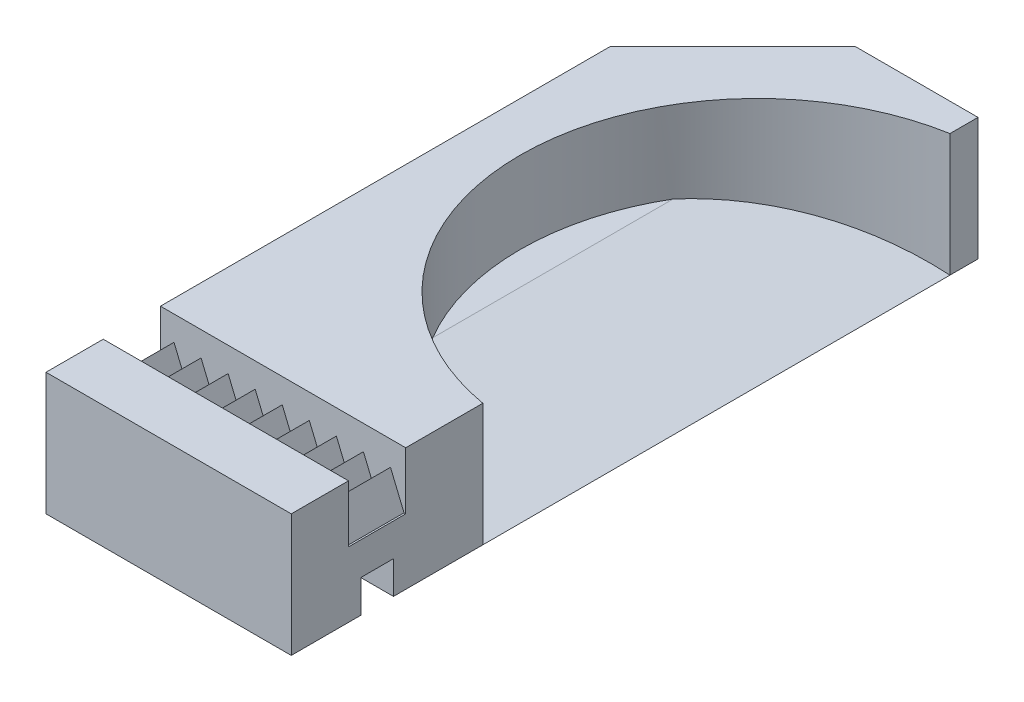
ISO-10303-21;
HEADER;
FILE_DESCRIPTION(('STEP AP214'),'2;1');
FILE_NAME('part.step','',(''),(''),'','','');
FILE_SCHEMA(('AUTOMOTIVE_DESIGN { 1 0 10303 214 1 1 1 1 }'));
ENDSEC;
DATA;
#1=APPLICATION_CONTEXT('core data for automotive mechanical design processes');
#2=APPLICATION_PROTOCOL_DEFINITION('international standard','automotive_design',2000,#1);
#3=PRODUCT_CONTEXT('',#1,'mechanical');
#4=PRODUCT('Part','Part','',(#3));
#5=PRODUCT_RELATED_PRODUCT_CATEGORY('part','',(#4));
#6=PRODUCT_DEFINITION_FORMATION('','',#4);
#7=PRODUCT_DEFINITION_CONTEXT('part definition',#1,'design');
#8=PRODUCT_DEFINITION('design','',#6,#7);
#9=PRODUCT_DEFINITION_SHAPE('','',#8);
#10=(LENGTH_UNIT() NAMED_UNIT(*) SI_UNIT(.MILLI.,.METRE.));
#11=(NAMED_UNIT(*) PLANE_ANGLE_UNIT() SI_UNIT($,.RADIAN.));
#12=(NAMED_UNIT(*) SI_UNIT($,.STERADIAN.) SOLID_ANGLE_UNIT());
#13=UNCERTAINTY_MEASURE_WITH_UNIT(LENGTH_MEASURE(1.E-05),#10,'distance_accuracy_value','');
#14=(GEOMETRIC_REPRESENTATION_CONTEXT(3) GLOBAL_UNCERTAINTY_ASSIGNED_CONTEXT((#13)) GLOBAL_UNIT_ASSIGNED_CONTEXT((#10,
#11,#12)) REPRESENTATION_CONTEXT('',''));
#15=CARTESIAN_POINT('',(0.,0.,0.));
#16=DIRECTION('',(0.,0.,1.));
#17=DIRECTION('',(1.,0.,0.));
#18=AXIS2_PLACEMENT_3D('',#15,#16,#17);
#19=CARTESIAN_POINT('',(-32.4128547970913,15.,-40.7804396814199));
#20=DIRECTION('',(1.,0.,0.));
#21=DIRECTION('',(0.,0.,-1.));
#22=AXIS2_PLACEMENT_3D('',#19,#20,#21);
#23=PLANE('',#22);
#24=DIRECTION('',(0.,-1.,0.));
#25=VECTOR('',#24,1.);
#26=CARTESIAN_POINT('',(-32.4128547970913,0.,34.7195603185801));
#27=LINE('',#26,#25);
#28=CARTESIAN_POINT('',(-32.4128547970913,4.,34.7195603185801));
#29=VERTEX_POINT('',#28);
#30=CARTESIAN_POINT('',(-32.4128547970913,0.,34.7195603185801));
#31=VERTEX_POINT('',#30);
#32=EDGE_CURVE('E262',#29,#31,#27,.T.);
#33=ORIENTED_EDGE('',*,*,#32,.T.);
#34=DIRECTION('',(0.,0.,1.));
#35=VECTOR('',#34,1.);
#36=CARTESIAN_POINT('',(-32.4128547970913,0.,-40.7804396814199));
#37=LINE('',#36,#35);
#38=CARTESIAN_POINT('',(-32.4128547970913,0.,43.2195603185801));
#39=VERTEX_POINT('',#38);
#40=EDGE_CURVE('E275',#31,#39,#37,.T.);
#41=ORIENTED_EDGE('',*,*,#40,.T.);
#42=DIRECTION('',(0.,-1.,0.));
#43=VECTOR('',#42,1.);
#44=CARTESIAN_POINT('',(-32.4128547970913,15.,43.2195603185801));
#45=LINE('',#44,#43);
#46=CARTESIAN_POINT('',(-32.4128547970913,15.,43.2195603185801));
#47=VERTEX_POINT('',#46);
#48=EDGE_CURVE('E310',#47,#39,#45,.T.);
#49=ORIENTED_EDGE('',*,*,#48,.F.);
#50=DIRECTION('',(0.,0.,1.));
#51=VECTOR('',#50,1.);
#52=CARTESIAN_POINT('',(-32.4128547970913,15.,-40.7804396814199));
#53=LINE('',#52,#51);
#54=CARTESIAN_POINT('',(-32.4128547970913,15.,36.2195603185801));
#55=VERTEX_POINT('',#54);
#56=EDGE_CURVE('E303',#55,#47,#53,.T.);
#57=ORIENTED_EDGE('',*,*,#56,.F.);
#58=DIRECTION('',(0.,1.,0.));
#59=VECTOR('',#58,1.);
#60=CARTESIAN_POINT('',(-32.4128547970913,8.,36.2195603185801));
#61=LINE('',#60,#59);
#62=CARTESIAN_POINT('',(-32.4128547970913,8.,36.2195603185801));
#63=VERTEX_POINT('',#62);
#64=EDGE_CURVE('E402',#63,#55,#61,.T.);
#65=ORIENTED_EDGE('',*,*,#64,.F.);
#66=DIRECTION('',(0.,0.,-1.));
#67=VECTOR('',#66,1.);
#68=CARTESIAN_POINT('',(-32.4128547970913,8.,36.2195603185801));
#69=LINE('',#68,#67);
#70=CARTESIAN_POINT('',(-32.4128547970913,8.,29.2195603185801));
#71=VERTEX_POINT('',#70);
#72=EDGE_CURVE('E404',#63,#71,#69,.T.);
#73=ORIENTED_EDGE('',*,*,#72,.T.);
#74=DIRECTION('',(0.,1.,0.));
#75=VECTOR('',#74,1.);
#76=CARTESIAN_POINT('',(-32.4128547970913,8.,29.2195603185801));
#77=LINE('',#76,#75);
#78=CARTESIAN_POINT('',(-32.4128547970913,15.,29.2195603185801));
#79=VERTEX_POINT('',#78);
#80=EDGE_CURVE('E342',#71,#79,#77,.T.);
#81=ORIENTED_EDGE('',*,*,#80,.T.);
#82=CARTESIAN_POINT('',(-32.4128547970913,15.,-25.7804396814199));
#83=VERTEX_POINT('',#82);
#84=EDGE_CURVE('E333',#83,#79,#53,.T.);
#85=ORIENTED_EDGE('',*,*,#84,.F.);
#86=DIRECTION('',(0.,-1.,0.));
#87=VECTOR('',#86,1.);
#88=CARTESIAN_POINT('',(-32.4128547970913,15.,-25.7804396814199));
#89=LINE('',#88,#87);
#90=CARTESIAN_POINT('',(-32.4128547970913,0.,-25.7804396814199));
#91=VERTEX_POINT('',#90);
#92=EDGE_CURVE('E320',#83,#91,#89,.T.);
#93=ORIENTED_EDGE('',*,*,#92,.T.);
#94=CARTESIAN_POINT('',(-32.4128547970913,0.,30.71956031858));
#95=VERTEX_POINT('',#94);
#96=EDGE_CURVE('E283',#91,#95,#37,.T.);
#97=ORIENTED_EDGE('',*,*,#96,.T.);
#98=DIRECTION('',(0.,-1.,0.));
#99=VECTOR('',#98,1.);
#100=CARTESIAN_POINT('',(-32.4128547970913,0.,30.7195603185801));
#101=LINE('',#100,#99);
#102=CARTESIAN_POINT('',(-32.4128547970913,4.,30.7195603185801));
#103=VERTEX_POINT('',#102);
#104=EDGE_CURVE('E52',#103,#95,#101,.T.);
#105=ORIENTED_EDGE('',*,*,#104,.F.);
#106=DIRECTION('',(0.,0.,1.));
#107=VECTOR('',#106,1.);
#108=CARTESIAN_POINT('',(-32.4128547970913,4.,34.7195603185801));
#109=LINE('',#108,#107);
#110=EDGE_CURVE('E278',#103,#29,#109,.T.);
#111=ORIENTED_EDGE('',*,*,#110,.T.);
#112=EDGE_LOOP('',(#33,#41,#49,#57,#65,#73,#81,#85,#93,#97,#105,#111));
#113=FACE_BOUND('',#112,.T.);
#114=ADVANCED_FACE('F37',(#113),#23,.F.);
#115=CARTESIAN_POINT('',(-2.41285479709127,15.,-40.7804396814199));
#116=DIRECTION('',(-1.,0.,0.));
#117=DIRECTION('',(0.,0.,1.));
#118=AXIS2_PLACEMENT_3D('',#115,#116,#117);
#119=PLANE('',#118);
#120=DIRECTION('',(0.,1.,0.));
#121=VECTOR('',#120,1.);
#122=CARTESIAN_POINT('',(-2.41285479709126,0.,34.7195603185801));
#123=LINE('',#122,#121);
#124=CARTESIAN_POINT('',(-2.41285479709126,0.,34.7195603185801));
#125=VERTEX_POINT('',#124);
#126=CARTESIAN_POINT('',(-2.41285479709126,4.,34.7195603185801));
#127=VERTEX_POINT('',#126);
#128=EDGE_CURVE('E265',#125,#127,#123,.T.);
#129=ORIENTED_EDGE('',*,*,#128,.T.);
#130=DIRECTION('',(0.,0.,-1.));
#131=VECTOR('',#130,1.);
#132=CARTESIAN_POINT('',(-2.41285479709126,4.,34.7195603185801));
#133=LINE('',#132,#131);
#134=CARTESIAN_POINT('',(-2.41285479709126,4.,30.7195603185801));
#135=VERTEX_POINT('',#134);
#136=EDGE_CURVE('E641',#127,#135,#133,.T.);
#137=ORIENTED_EDGE('',*,*,#136,.T.);
#138=DIRECTION('',(0.,1.,0.));
#139=VECTOR('',#138,1.);
#140=CARTESIAN_POINT('',(-2.41285479709126,0.,30.7195603185801));
#141=LINE('',#140,#139);
#142=CARTESIAN_POINT('',(-2.41285479709126,0.,30.7195603185801));
#143=VERTEX_POINT('',#142);
#144=EDGE_CURVE('E271',#143,#135,#141,.T.);
#145=ORIENTED_EDGE('',*,*,#144,.F.);
#146=DIRECTION('',(0.,0.,-1.));
#147=VECTOR('',#146,1.);
#148=CARTESIAN_POINT('',(-2.41285479709127,0.,-40.7804396814199));
#149=LINE('',#148,#147);
#150=CARTESIAN_POINT('',(-2.41285479709127,0.,19.7852740327515));
#151=VERTEX_POINT('',#150);
#152=EDGE_CURVE('E299',#143,#151,#149,.T.);
#153=ORIENTED_EDGE('',*,*,#152,.T.);
#154=DIRECTION('',(0.,1.,0.));
#155=VECTOR('',#154,1.);
#156=CARTESIAN_POINT('',(-2.41285479709126,5.,19.7852740327515));
#157=LINE('',#156,#155);
#158=CARTESIAN_POINT('',(-2.41285479709126,15.,19.7852740327515));
#159=VERTEX_POINT('',#158);
#160=EDGE_CURVE('E284',#151,#159,#157,.T.);
#161=ORIENTED_EDGE('',*,*,#160,.T.);
#162=DIRECTION('',(0.,0.,-1.));
#163=VECTOR('',#162,1.);
#164=CARTESIAN_POINT('',(-2.41285479709127,15.,-40.7804396814199));
#165=LINE('',#164,#163);
#166=CARTESIAN_POINT('',(-2.41285479709127,15.,29.2195603185801));
#167=VERTEX_POINT('',#166);
#168=EDGE_CURVE('E390',#167,#159,#165,.T.);
#169=ORIENTED_EDGE('',*,*,#168,.F.);
#170=DIRECTION('',(0.,1.,0.));
#171=VECTOR('',#170,1.);
#172=CARTESIAN_POINT('',(-2.41285479709126,8.,29.2195603185801));
#173=LINE('',#172,#171);
#174=CARTESIAN_POINT('',(-2.41285479709126,8.,29.2195603185801));
#175=VERTEX_POINT('',#174);
#176=EDGE_CURVE('E385',#175,#167,#173,.T.);
#177=ORIENTED_EDGE('',*,*,#176,.F.);
#178=DIRECTION('',(0.,0.,-1.));
#179=VECTOR('',#178,1.);
#180=CARTESIAN_POINT('',(-2.41285479709126,8.,36.2195603185801));
#181=LINE('',#180,#179);
#182=CARTESIAN_POINT('',(-2.41285479709126,8.,36.2195603185801));
#183=VERTEX_POINT('',#182);
#184=EDGE_CURVE('E399',#183,#175,#181,.T.);
#185=ORIENTED_EDGE('',*,*,#184,.F.);
#186=DIRECTION('',(0.,1.,0.));
#187=VECTOR('',#186,1.);
#188=CARTESIAN_POINT('',(-2.41285479709126,8.,36.2195603185801));
#189=LINE('',#188,#187);
#190=CARTESIAN_POINT('',(-2.41285479709126,15.,36.2195603185801));
#191=VERTEX_POINT('',#190);
#192=EDGE_CURVE('E382',#183,#191,#189,.T.);
#193=ORIENTED_EDGE('',*,*,#192,.T.);
#194=CARTESIAN_POINT('',(-2.41285479709126,15.,43.2195603185801));
#195=VERTEX_POINT('',#194);
#196=EDGE_CURVE('E388',#195,#191,#165,.T.);
#197=ORIENTED_EDGE('',*,*,#196,.F.);
#198=DIRECTION('',(0.,-1.,0.));
#199=VECTOR('',#198,1.);
#200=CARTESIAN_POINT('',(-2.41285479709126,15.,43.2195603185801));
#201=LINE('',#200,#199);
#202=CARTESIAN_POINT('',(-2.41285479709126,0.,43.2195603185801));
#203=VERTEX_POINT('',#202);
#204=EDGE_CURVE('E307',#195,#203,#201,.T.);
#205=ORIENTED_EDGE('',*,*,#204,.T.);
#206=EDGE_CURVE('E296',#203,#125,#149,.T.);
#207=ORIENTED_EDGE('',*,*,#206,.T.);
#208=EDGE_LOOP('',(#129,#137,#145,#153,#161,#169,#177,#185,#193,#197,#205,#207));
#209=FACE_BOUND('',#208,.T.);
#210=ADVANCED_FACE('F362',(#209),#119,.F.);
#211=CARTESIAN_POINT('',(0.,0.,0.));
#212=DIRECTION('',(0.,1.,0.));
#213=DIRECTION('',(0.,0.,1.));
#214=AXIS2_PLACEMENT_3D('',#211,#212,#213);
#215=PLANE('',#214);
#216=DIRECTION('',(1.,0.,0.));
#217=VECTOR('',#216,1.);
#218=CARTESIAN_POINT('',(-32.4138547970913,0.,34.7195603185801));
#219=LINE('',#218,#217);
#220=EDGE_CURVE('E259',#31,#125,#219,.T.);
#221=ORIENTED_EDGE('',*,*,#220,.T.);
#222=ORIENTED_EDGE('',*,*,#206,.F.);
#223=DIRECTION('',(1.,0.,0.));
#224=VECTOR('',#223,1.);
#225=CARTESIAN_POINT('',(-32.4128547970913,0.,43.2195603185801));
#226=LINE('',#225,#224);
#227=EDGE_CURVE('E281',#39,#203,#226,.T.);
#228=ORIENTED_EDGE('',*,*,#227,.F.);
#229=ORIENTED_EDGE('',*,*,#40,.F.);
#230=EDGE_LOOP('',(#221,#222,#228,#229));
#231=FACE_BOUND('',#230,.T.);
#232=ADVANCED_FACE('F280',(#231),#215,.F.);
#233=CARTESIAN_POINT('',(-2.41285479709126,8.,36.2195603185801));
#234=DIRECTION('',(0.,0.,-1.));
#235=DIRECTION('',(-1.,0.,0.));
#236=AXIS2_PLACEMENT_3D('',#233,#234,#235);
#237=PLANE('',#236);
#238=DIRECTION('',(-0.382683432365093,0.923879532511285,0.));
#239=VECTOR('',#238,1.);
#240=CARTESIAN_POINT('',(-25.7891462981065,8.,36.2195603185801));
#241=LINE('',#240,#239);
#242=CARTESIAN_POINT('',(-25.7910005475989,8.00447655427257,36.2195603185801));
#243=VERTEX_POINT('',#242);
#244=CARTESIAN_POINT('',(-27.4460005475989,12.,36.2195603185801));
#245=VERTEX_POINT('',#244);
#246=EDGE_CURVE('E60',#243,#245,#241,.T.);
#247=ORIENTED_EDGE('',*,*,#246,.T.);
#248=DIRECTION('',(-0.382683432365093,-0.923879532511285,0.));
#249=VECTOR('',#248,1.);
#250=CARTESIAN_POINT('',(-27.4460005475989,12.,36.2195603185801));
#251=LINE('',#250,#249);
#252=CARTESIAN_POINT('',(-29.1010005475989,8.00447655427257,36.2195603185801));
#253=VERTEX_POINT('',#252);
#254=EDGE_CURVE('E542',#245,#253,#251,.T.);
#255=ORIENTED_EDGE('',*,*,#254,.T.);
#256=DIRECTION('',(-0.382683432365093,0.923879532511285,0.));
#257=VECTOR('',#256,1.);
#258=CARTESIAN_POINT('',(-29.0991462981065,8.,36.2195603185801));
#259=LINE('',#258,#257);
#260=CARTESIAN_POINT('',(-30.7560005475989,12.,36.2195603185801));
#261=VERTEX_POINT('',#260);
#262=EDGE_CURVE('E555',#253,#261,#259,.T.);
#263=ORIENTED_EDGE('',*,*,#262,.T.);
#264=DIRECTION('',(-0.382683432365093,-0.923879532511285,0.));
#265=VECTOR('',#264,1.);
#266=CARTESIAN_POINT('',(-30.7560005475989,12.,36.2195603185801));
#267=LINE('',#266,#265);
#268=EDGE_CURVE('E421',#261,#63,#267,.T.);
#269=ORIENTED_EDGE('',*,*,#268,.T.);
#270=ORIENTED_EDGE('',*,*,#64,.T.);
#271=DIRECTION('',(-1.,0.,0.));
#272=VECTOR('',#271,1.);
#273=CARTESIAN_POINT('',(-2.41285479709126,15.,36.2195603185801));
#274=LINE('',#273,#272);
#275=EDGE_CURVE('E413',#191,#55,#274,.T.);
#276=ORIENTED_EDGE('',*,*,#275,.F.);
#277=ORIENTED_EDGE('',*,*,#192,.F.);
#278=DIRECTION('',(-1.,0.,0.));
#279=VECTOR('',#278,1.);
#280=CARTESIAN_POINT('',(-2.41285479709126,8.,36.2195603185801));
#281=LINE('',#280,#279);
#282=CARTESIAN_POINT('',(-2.61914629810648,8.,36.2195603185801));
#283=VERTEX_POINT('',#282);
#284=EDGE_CURVE('E401',#183,#283,#281,.T.);
#285=ORIENTED_EDGE('',*,*,#284,.T.);
#286=DIRECTION('',(-0.382683432365093,0.923879532511285,0.));
#287=VECTOR('',#286,1.);
#288=CARTESIAN_POINT('',(-2.61914629810648,8.,36.2195603185801));
#289=LINE('',#288,#287);
#290=CARTESIAN_POINT('',(-4.27600054759887,12.,36.2195603185801));
#291=VERTEX_POINT('',#290);
#292=EDGE_CURVE('E442',#283,#291,#289,.T.);
#293=ORIENTED_EDGE('',*,*,#292,.T.);
#294=DIRECTION('',(-0.382683432365093,-0.923879532511285,0.));
#295=VECTOR('',#294,1.);
#296=CARTESIAN_POINT('',(-4.27600054759887,12.,36.2195603185801));
#297=LINE('',#296,#295);
#298=CARTESIAN_POINT('',(-5.93100054759887,8.00447655427257,36.2195603185801));
#299=VERTEX_POINT('',#298);
#300=EDGE_CURVE('E632',#291,#299,#297,.T.);
#301=ORIENTED_EDGE('',*,*,#300,.T.);
#302=DIRECTION('',(-0.382683432365093,0.923879532511285,0.));
#303=VECTOR('',#302,1.);
#304=CARTESIAN_POINT('',(-5.92914629810648,8.,36.2195603185801));
#305=LINE('',#304,#303);
#306=CARTESIAN_POINT('',(-7.58600054759887,12.,36.2195603185801));
#307=VERTEX_POINT('',#306);
#308=EDGE_CURVE('E448',#299,#307,#305,.T.);
#309=ORIENTED_EDGE('',*,*,#308,.T.);
#310=DIRECTION('',(-0.382683432365093,-0.923879532511285,0.));
#311=VECTOR('',#310,1.);
#312=CARTESIAN_POINT('',(-7.58600054759887,12.,36.2195603185801));
#313=LINE('',#312,#311);
#314=CARTESIAN_POINT('',(-9.24100054759888,8.00447655427257,36.2195603185801));
#315=VERTEX_POINT('',#314);
#316=EDGE_CURVE('E446',#307,#315,#313,.T.);
#317=ORIENTED_EDGE('',*,*,#316,.T.);
#318=DIRECTION('',(-0.382683432365093,0.923879532511285,0.));
#319=VECTOR('',#318,1.);
#320=CARTESIAN_POINT('',(-9.23914629810648,8.,36.2195603185801));
#321=LINE('',#320,#319);
#322=CARTESIAN_POINT('',(-10.8960005475989,12.,36.2195603185801));
#323=VERTEX_POINT('',#322);
#324=EDGE_CURVE('E464',#315,#323,#321,.T.);
#325=ORIENTED_EDGE('',*,*,#324,.T.);
#326=DIRECTION('',(-0.382683432365093,-0.923879532511285,0.));
#327=VECTOR('',#326,1.);
#328=CARTESIAN_POINT('',(-10.8960005475989,12.,36.2195603185801));
#329=LINE('',#328,#327);
#330=CARTESIAN_POINT('',(-12.5510005475989,8.00447655427257,36.2195603185801));
#331=VERTEX_POINT('',#330);
#332=EDGE_CURVE('E462',#323,#331,#329,.T.);
#333=ORIENTED_EDGE('',*,*,#332,.T.);
#334=DIRECTION('',(-0.382683432365093,0.923879532511285,0.));
#335=VECTOR('',#334,1.);
#336=CARTESIAN_POINT('',(-12.5491462981065,8.,36.2195603185801));
#337=LINE('',#336,#335);
#338=CARTESIAN_POINT('',(-14.2060005475989,12.,36.2195603185801));
#339=VERTEX_POINT('',#338);
#340=EDGE_CURVE('E480',#331,#339,#337,.T.);
#341=ORIENTED_EDGE('',*,*,#340,.T.);
#342=DIRECTION('',(-0.382683432365093,-0.923879532511285,0.));
#343=VECTOR('',#342,1.);
#344=CARTESIAN_POINT('',(-14.2060005475989,12.,36.2195603185801));
#345=LINE('',#344,#343);
#346=CARTESIAN_POINT('',(-15.8610005475989,8.00447655427257,36.2195603185801));
#347=VERTEX_POINT('',#346);
#348=EDGE_CURVE('E478',#339,#347,#345,.T.);
#349=ORIENTED_EDGE('',*,*,#348,.T.);
#350=DIRECTION('',(-0.382683432365093,0.923879532511285,0.));
#351=VECTOR('',#350,1.);
#352=CARTESIAN_POINT('',(-15.8591462981065,8.,36.2195603185801));
#353=LINE('',#352,#351);
#354=CARTESIAN_POINT('',(-17.5160005475989,12.,36.2195603185801));
#355=VERTEX_POINT('',#354);
#356=EDGE_CURVE('E496',#347,#355,#353,.T.);
#357=ORIENTED_EDGE('',*,*,#356,.T.);
#358=DIRECTION('',(-0.382683432365093,-0.923879532511285,0.));
#359=VECTOR('',#358,1.);
#360=CARTESIAN_POINT('',(-17.5160005475989,12.,36.2195603185801));
#361=LINE('',#360,#359);
#362=CARTESIAN_POINT('',(-19.1710005475989,8.00447655427257,36.2195603185801));
#363=VERTEX_POINT('',#362);
#364=EDGE_CURVE('E494',#355,#363,#361,.T.);
#365=ORIENTED_EDGE('',*,*,#364,.T.);
#366=DIRECTION('',(-0.382683432365093,0.923879532511285,0.));
#367=VECTOR('',#366,1.);
#368=CARTESIAN_POINT('',(-19.1691462981065,8.,36.2195603185801));
#369=LINE('',#368,#367);
#370=CARTESIAN_POINT('',(-20.8260005475989,12.,36.2195603185801));
#371=VERTEX_POINT('',#370);
#372=EDGE_CURVE('E512',#363,#371,#369,.T.);
#373=ORIENTED_EDGE('',*,*,#372,.T.);
#374=DIRECTION('',(-0.382683432365093,-0.923879532511285,0.));
#375=VECTOR('',#374,1.);
#376=CARTESIAN_POINT('',(-20.8260005475989,12.,36.2195603185801));
#377=LINE('',#376,#375);
#378=CARTESIAN_POINT('',(-22.4810005475989,8.00447655427257,36.2195603185801));
#379=VERTEX_POINT('',#378);
#380=EDGE_CURVE('E510',#371,#379,#377,.T.);
#381=ORIENTED_EDGE('',*,*,#380,.T.);
#382=DIRECTION('',(-0.382683432365093,0.923879532511285,0.));
#383=VECTOR('',#382,1.);
#384=CARTESIAN_POINT('',(-22.4791462981065,8.,36.2195603185801));
#385=LINE('',#384,#383);
#386=CARTESIAN_POINT('',(-24.1360005475989,12.,36.2195603185801));
#387=VERTEX_POINT('',#386);
#388=EDGE_CURVE('E528',#379,#387,#385,.T.);
#389=ORIENTED_EDGE('',*,*,#388,.T.);
#390=DIRECTION('',(-0.382683432365093,-0.923879532511285,0.));
#391=VECTOR('',#390,1.);
#392=CARTESIAN_POINT('',(-24.1360005475989,12.,36.2195603185801));
#393=LINE('',#392,#391);
#394=EDGE_CURVE('E526',#387,#243,#393,.T.);
#395=ORIENTED_EDGE('',*,*,#394,.T.);
#396=EDGE_LOOP('',(#247,#255,#263,#269,#270,#276,#277,#285,#293,#301,#309,#317,#325,#333,#341,
#349,#357,#365,#373,#381,#389,#395));
#397=FACE_BOUND('',#396,.T.);
#398=ADVANCED_FACE('F419',(#397),#237,.T.);
#399=CARTESIAN_POINT('',(-2.41285479709126,8.,29.2195603185801));
#400=DIRECTION('',(0.,0.,-1.));
#401=DIRECTION('',(-1.,0.,0.));
#402=AXIS2_PLACEMENT_3D('',#399,#400,#401);
#403=PLANE('',#402);
#404=DIRECTION('',(-0.382683432365093,-0.923879532511285,0.));
#405=VECTOR('',#404,1.);
#406=CARTESIAN_POINT('',(-27.4460005475989,12.,29.2195603185801));
#407=LINE('',#406,#405);
#408=CARTESIAN_POINT('',(-27.4460005475989,12.,29.2195603185801));
#409=VERTEX_POINT('',#408);
#410=CARTESIAN_POINT('',(-29.1010005475989,8.00447655427257,29.2195603185801));
#411=VERTEX_POINT('',#410);
#412=EDGE_CURVE('E541',#409,#411,#407,.T.);
#413=ORIENTED_EDGE('',*,*,#412,.F.);
#414=DIRECTION('',(-0.382683432365093,0.923879532511285,0.));
#415=VECTOR('',#414,1.);
#416=CARTESIAN_POINT('',(-25.7891462981065,8.,29.2195603185801));
#417=LINE('',#416,#415);
#418=CARTESIAN_POINT('',(-25.7910005475989,8.00447655427257,29.2195603185801));
#419=VERTEX_POINT('',#418);
#420=EDGE_CURVE('E544',#419,#409,#417,.T.);
#421=ORIENTED_EDGE('',*,*,#420,.F.);
#422=DIRECTION('',(-0.382683432365093,-0.923879532511285,0.));
#423=VECTOR('',#422,1.);
#424=CARTESIAN_POINT('',(-24.1360005475989,12.,29.2195603185801));
#425=LINE('',#424,#423);
#426=CARTESIAN_POINT('',(-24.1360005475989,12.,29.2195603185801));
#427=VERTEX_POINT('',#426);
#428=EDGE_CURVE('E525',#427,#419,#425,.T.);
#429=ORIENTED_EDGE('',*,*,#428,.F.);
#430=DIRECTION('',(-0.382683432365093,0.923879532511285,0.));
#431=VECTOR('',#430,1.);
#432=CARTESIAN_POINT('',(-22.4791462981065,8.,29.2195603185801));
#433=LINE('',#432,#431);
#434=CARTESIAN_POINT('',(-22.4810005475989,8.00447655427257,29.2195603185801));
#435=VERTEX_POINT('',#434);
#436=EDGE_CURVE('E529',#435,#427,#433,.T.);
#437=ORIENTED_EDGE('',*,*,#436,.F.);
#438=DIRECTION('',(-0.382683432365093,-0.923879532511285,0.));
#439=VECTOR('',#438,1.);
#440=CARTESIAN_POINT('',(-20.8260005475989,12.,29.2195603185801));
#441=LINE('',#440,#439);
#442=CARTESIAN_POINT('',(-20.8260005475989,12.,29.2195603185801));
#443=VERTEX_POINT('',#442);
#444=EDGE_CURVE('E509',#443,#435,#441,.T.);
#445=ORIENTED_EDGE('',*,*,#444,.F.);
#446=DIRECTION('',(-0.382683432365093,0.923879532511285,0.));
#447=VECTOR('',#446,1.);
#448=CARTESIAN_POINT('',(-19.1691462981065,8.,29.2195603185801));
#449=LINE('',#448,#447);
#450=CARTESIAN_POINT('',(-19.1710005475989,8.00447655427257,29.2195603185801));
#451=VERTEX_POINT('',#450);
#452=EDGE_CURVE('E513',#451,#443,#449,.T.);
#453=ORIENTED_EDGE('',*,*,#452,.F.);
#454=DIRECTION('',(-0.382683432365093,-0.923879532511285,0.));
#455=VECTOR('',#454,1.);
#456=CARTESIAN_POINT('',(-17.5160005475989,12.,29.2195603185801));
#457=LINE('',#456,#455);
#458=CARTESIAN_POINT('',(-17.5160005475989,12.,29.2195603185801));
#459=VERTEX_POINT('',#458);
#460=EDGE_CURVE('E493',#459,#451,#457,.T.);
#461=ORIENTED_EDGE('',*,*,#460,.F.);
#462=DIRECTION('',(-0.382683432365093,0.923879532511285,0.));
#463=VECTOR('',#462,1.);
#464=CARTESIAN_POINT('',(-15.8591462981065,8.,29.2195603185801));
#465=LINE('',#464,#463);
#466=CARTESIAN_POINT('',(-15.8610005475989,8.00447655427257,29.2195603185801));
#467=VERTEX_POINT('',#466);
#468=EDGE_CURVE('E497',#467,#459,#465,.T.);
#469=ORIENTED_EDGE('',*,*,#468,.F.);
#470=DIRECTION('',(-0.382683432365093,-0.923879532511285,0.));
#471=VECTOR('',#470,1.);
#472=CARTESIAN_POINT('',(-14.2060005475989,12.,29.2195603185801));
#473=LINE('',#472,#471);
#474=CARTESIAN_POINT('',(-14.2060005475989,12.,29.2195603185801));
#475=VERTEX_POINT('',#474);
#476=EDGE_CURVE('E477',#475,#467,#473,.T.);
#477=ORIENTED_EDGE('',*,*,#476,.F.);
#478=DIRECTION('',(-0.382683432365093,0.923879532511285,0.));
#479=VECTOR('',#478,1.);
#480=CARTESIAN_POINT('',(-12.5491462981065,8.,29.2195603185801));
#481=LINE('',#480,#479);
#482=CARTESIAN_POINT('',(-12.5510005475989,8.00447655427257,29.2195603185801));
#483=VERTEX_POINT('',#482);
#484=EDGE_CURVE('E481',#483,#475,#481,.T.);
#485=ORIENTED_EDGE('',*,*,#484,.F.);
#486=DIRECTION('',(-0.382683432365093,-0.923879532511285,0.));
#487=VECTOR('',#486,1.);
#488=CARTESIAN_POINT('',(-10.8960005475989,12.,29.2195603185801));
#489=LINE('',#488,#487);
#490=CARTESIAN_POINT('',(-10.8960005475989,12.,29.2195603185801));
#491=VERTEX_POINT('',#490);
#492=EDGE_CURVE('E461',#491,#483,#489,.T.);
#493=ORIENTED_EDGE('',*,*,#492,.F.);
#494=DIRECTION('',(-0.382683432365093,0.923879532511285,0.));
#495=VECTOR('',#494,1.);
#496=CARTESIAN_POINT('',(-9.23914629810648,8.,29.2195603185801));
#497=LINE('',#496,#495);
#498=CARTESIAN_POINT('',(-9.24100054759888,8.00447655427257,29.2195603185801));
#499=VERTEX_POINT('',#498);
#500=EDGE_CURVE('E465',#499,#491,#497,.T.);
#501=ORIENTED_EDGE('',*,*,#500,.F.);
#502=DIRECTION('',(-0.382683432365093,-0.923879532511285,0.));
#503=VECTOR('',#502,1.);
#504=CARTESIAN_POINT('',(-7.58600054759887,12.,29.2195603185801));
#505=LINE('',#504,#503);
#506=CARTESIAN_POINT('',(-7.58600054759887,12.,29.2195603185801));
#507=VERTEX_POINT('',#506);
#508=EDGE_CURVE('E439',#507,#499,#505,.T.);
#509=ORIENTED_EDGE('',*,*,#508,.F.);
#510=DIRECTION('',(-0.382683432365093,0.923879532511285,0.));
#511=VECTOR('',#510,1.);
#512=CARTESIAN_POINT('',(-5.92914629810648,8.,29.2195603185801));
#513=LINE('',#512,#511);
#514=CARTESIAN_POINT('',(-5.93100054759887,8.00447655427257,29.2195603185801));
#515=VERTEX_POINT('',#514);
#516=EDGE_CURVE('E449',#515,#507,#513,.T.);
#517=ORIENTED_EDGE('',*,*,#516,.F.);
#518=DIRECTION('',(-0.382683432365093,-0.923879532511285,0.));
#519=VECTOR('',#518,1.);
#520=CARTESIAN_POINT('',(-4.27600054759887,12.,29.2195603185801));
#521=LINE('',#520,#519);
#522=CARTESIAN_POINT('',(-4.27600054759887,12.,29.2195603185801));
#523=VERTEX_POINT('',#522);
#524=EDGE_CURVE('E626',#523,#515,#521,.T.);
#525=ORIENTED_EDGE('',*,*,#524,.F.);
#526=DIRECTION('',(-0.382683432365093,0.923879532511285,0.));
#527=VECTOR('',#526,1.);
#528=CARTESIAN_POINT('',(-2.61914629810648,8.,29.2195603185801));
#529=LINE('',#528,#527);
#530=CARTESIAN_POINT('',(-2.61914629810648,8.,29.2195603185801));
#531=VERTEX_POINT('',#530);
#532=EDGE_CURVE('E629',#531,#523,#529,.T.);
#533=ORIENTED_EDGE('',*,*,#532,.F.);
#534=DIRECTION('',(-1.,0.,0.));
#535=VECTOR('',#534,1.);
#536=CARTESIAN_POINT('',(-2.41285479709126,8.,29.2195603185801));
#537=LINE('',#536,#535);
#538=EDGE_CURVE('E408',#175,#531,#537,.T.);
#539=ORIENTED_EDGE('',*,*,#538,.F.);
#540=ORIENTED_EDGE('',*,*,#176,.T.);
#541=DIRECTION('',(-1.,0.,0.));
#542=VECTOR('',#541,1.);
#543=CARTESIAN_POINT('',(-2.41285479709126,15.,29.2195603185801));
#544=LINE('',#543,#542);
#545=EDGE_CURVE('E394',#167,#79,#544,.T.);
#546=ORIENTED_EDGE('',*,*,#545,.T.);
#547=ORIENTED_EDGE('',*,*,#80,.F.);
#548=DIRECTION('',(-0.382683432365093,-0.923879532511285,0.));
#549=VECTOR('',#548,1.);
#550=CARTESIAN_POINT('',(-30.7560005475989,12.,29.2195603185801));
#551=LINE('',#550,#549);
#552=CARTESIAN_POINT('',(-30.7560005475989,12.,29.2195603185801));
#553=VERTEX_POINT('',#552);
#554=EDGE_CURVE('E553',#553,#71,#551,.T.);
#555=ORIENTED_EDGE('',*,*,#554,.F.);
#556=DIRECTION('',(-0.382683432365093,0.923879532511285,0.));
#557=VECTOR('',#556,1.);
#558=CARTESIAN_POINT('',(-29.0991462981065,8.,29.2195603185801));
#559=LINE('',#558,#557);
#560=EDGE_CURVE('E556',#411,#553,#559,.T.);
#561=ORIENTED_EDGE('',*,*,#560,.F.);
#562=EDGE_LOOP('',(#413,#421,#429,#437,#445,#453,#461,#469,#477,#485,#493,#501,#509,#517,#525,
#533,#539,#540,#546,#547,#555,#561));
#563=FACE_BOUND('',#562,.T.);
#564=ADVANCED_FACE('F568',(#563),#403,.F.);
#565=CARTESIAN_POINT('',(0.,8.,0.));
#566=DIRECTION('',(0.,1.,0.));
#567=DIRECTION('',(0.,0.,1.));
#568=AXIS2_PLACEMENT_3D('',#565,#566,#567);
#569=PLANE('',#568);
#570=ORIENTED_EDGE('',*,*,#538,.T.);
#571=DIRECTION('',(0.,0.,-1.));
#572=VECTOR('',#571,1.);
#573=CARTESIAN_POINT('',(-2.61914629810648,8.,36.2195603185801));
#574=LINE('',#573,#572);
#575=EDGE_CURVE('E432',#283,#531,#574,.T.);
#576=ORIENTED_EDGE('',*,*,#575,.F.);
#577=ORIENTED_EDGE('',*,*,#284,.F.);
#578=ORIENTED_EDGE('',*,*,#184,.T.);
#579=EDGE_LOOP('',(#570,#576,#577,#578));
#580=FACE_BOUND('',#579,.T.);
#581=ADVANCED_FACE('F430',(#580),#569,.T.);
#582=CARTESIAN_POINT('',(-29.0991462981065,8.,36.2195603185801));
#583=DIRECTION('',(-0.923879532511285,-0.382683432365093,0.));
#584=DIRECTION('',(0.382683432365093,-0.923879532511285,0.));
#585=AXIS2_PLACEMENT_3D('',#582,#583,#584);
#586=PLANE('',#585);
#587=DIRECTION('',(0.,0.,1.));
#588=VECTOR('',#587,1.);
#589=CARTESIAN_POINT('',(-29.1010005475989,8.00447655427257,36.2195603185801));
#590=LINE('',#589,#588);
#591=EDGE_CURVE('E11',#411,#253,#590,.T.);
#592=ORIENTED_EDGE('',*,*,#591,.F.);
#593=ORIENTED_EDGE('',*,*,#560,.T.);
#594=DIRECTION('',(0.,0.,-1.));
#595=VECTOR('',#594,1.);
#596=CARTESIAN_POINT('',(-30.7560005475989,12.,36.2195603185801));
#597=LINE('',#596,#595);
#598=EDGE_CURVE('E414',#261,#553,#597,.T.);
#599=ORIENTED_EDGE('',*,*,#598,.F.);
#600=ORIENTED_EDGE('',*,*,#262,.F.);
#601=EDGE_LOOP('',(#592,#593,#599,#600));
#602=FACE_BOUND('',#601,.T.);
#603=ADVANCED_FACE('F690',(#602),#586,.F.);
#604=CARTESIAN_POINT('',(0.,15.,0.));
#605=DIRECTION('',(0.,1.,0.));
#606=DIRECTION('',(0.,0.,1.));
#607=AXIS2_PLACEMENT_3D('',#604,#605,#606);
#608=PLANE('',#607);
#609=ORIENTED_EDGE('',*,*,#196,.T.);
#610=ORIENTED_EDGE('',*,*,#275,.T.);
#611=ORIENTED_EDGE('',*,*,#56,.T.);
#612=DIRECTION('',(1.,0.,0.));
#613=VECTOR('',#612,1.);
#614=CARTESIAN_POINT('',(-32.4128547970913,15.,43.2195603185801));
#615=LINE('',#614,#613);
#616=EDGE_CURVE('E343',#47,#195,#615,.T.);
#617=ORIENTED_EDGE('',*,*,#616,.T.);
#618=EDGE_LOOP('',(#609,#610,#611,#617));
#619=FACE_BOUND('',#618,.T.);
#620=ADVANCED_FACE('F423',(#619),#608,.T.);
#621=DIRECTION('',(0.,1.,0.));
#622=VECTOR('',#621,1.);
#623=CARTESIAN_POINT('',(-2.41285479709127,5.,-37.3461533955913));
#624=LINE('',#623,#622);
#625=CARTESIAN_POINT('',(-2.41285479709127,15.,-37.3461533955913));
#626=VERTEX_POINT('',#625);
#627=CARTESIAN_POINT('',(-2.41285479709127,0.,-37.3461533955913));
#628=VERTEX_POINT('',#627);
#629=EDGE_CURVE('E288',#626,#628,#624,.F.);
#630=ORIENTED_EDGE('',*,*,#629,.T.);
#631=CARTESIAN_POINT('',(-2.41285479709127,0.,-40.7804396814199));
#632=VERTEX_POINT('',#631);
#633=EDGE_CURVE('E295',#628,#632,#149,.T.);
#634=ORIENTED_EDGE('',*,*,#633,.T.);
#635=DIRECTION('',(0.,-1.,0.));
#636=VECTOR('',#635,1.);
#637=CARTESIAN_POINT('',(-2.41285479709127,15.,-40.7804396814199));
#638=LINE('',#637,#636);
#639=CARTESIAN_POINT('',(-2.41285479709127,15.,-40.7804396814199));
#640=VERTEX_POINT('',#639);
#641=EDGE_CURVE('E304',#640,#632,#638,.T.);
#642=ORIENTED_EDGE('',*,*,#641,.F.);
#643=EDGE_CURVE('E356',#626,#640,#165,.T.);
#644=ORIENTED_EDGE('',*,*,#643,.F.);
#645=EDGE_LOOP('',(#630,#634,#642,#644));
#646=FACE_BOUND('',#645,.T.);
#647=ADVANCED_FACE('F355',(#646),#119,.F.);
#648=CARTESIAN_POINT('',(-32.4128547970913,15.,43.2195603185801));
#649=DIRECTION('',(0.,0.,-1.));
#650=DIRECTION('',(-1.,0.,0.));
#651=AXIS2_PLACEMENT_3D('',#648,#649,#650);
#652=PLANE('',#651);
#653=ORIENTED_EDGE('',*,*,#227,.T.);
#654=ORIENTED_EDGE('',*,*,#204,.F.);
#655=ORIENTED_EDGE('',*,*,#616,.F.);
#656=ORIENTED_EDGE('',*,*,#48,.T.);
#657=EDGE_LOOP('',(#653,#654,#655,#656));
#658=FACE_BOUND('',#657,.T.);
#659=ADVANCED_FACE('F426',(#658),#652,.F.);
#660=CARTESIAN_POINT('',(-32.4128547970913,15.,-40.7804396814199));
#661=DIRECTION('',(0.,0.,1.));
#662=DIRECTION('',(1.,0.,0.));
#663=AXIS2_PLACEMENT_3D('',#660,#661,#662);
#664=PLANE('',#663);
#665=DIRECTION('',(-1.,0.,0.));
#666=VECTOR('',#665,1.);
#667=CARTESIAN_POINT('',(-32.4128547970913,0.,-40.7804396814199));
#668=LINE('',#667,#666);
#669=CARTESIAN_POINT('',(-17.4128547970912,0.,-40.7804396814199));
#670=VERTEX_POINT('',#669);
#671=EDGE_CURVE('E298',#632,#670,#668,.T.);
#672=ORIENTED_EDGE('',*,*,#671,.T.);
#673=DIRECTION('',(0.,1.,0.));
#674=VECTOR('',#673,1.);
#675=CARTESIAN_POINT('',(-17.4128547970912,15.,-40.7804396814199));
#676=LINE('',#675,#674);
#677=CARTESIAN_POINT('',(-17.4128547970912,15.,-40.7804396814199));
#678=VERTEX_POINT('',#677);
#679=EDGE_CURVE('E325',#670,#678,#676,.T.);
#680=ORIENTED_EDGE('',*,*,#679,.T.);
#681=DIRECTION('',(-1.,0.,0.));
#682=VECTOR('',#681,1.);
#683=CARTESIAN_POINT('',(-32.4128547970913,15.,-40.7804396814199));
#684=LINE('',#683,#682);
#685=EDGE_CURVE('E292',#640,#678,#684,.T.);
#686=ORIENTED_EDGE('',*,*,#685,.F.);
#687=ORIENTED_EDGE('',*,*,#641,.T.);
#688=EDGE_LOOP('',(#672,#680,#686,#687));
#689=FACE_BOUND('',#688,.T.);
#690=ADVANCED_FACE('F351',(#689),#664,.F.);
#691=ORIENTED_EDGE('',*,*,#545,.F.);
#692=ORIENTED_EDGE('',*,*,#168,.T.);
#693=CARTESIAN_POINT('',(2.58714520290874,15.,-8.78043968141991));
#694=DIRECTION('',(0.,1.,0.));
#695=DIRECTION('',(0.,0.,1.));
#696=AXIS2_PLACEMENT_3D('',#693,#694,#695);
#697=CIRCLE('',#696,29.);
#698=EDGE_CURVE('E373',#626,#159,#697,.T.);
#699=ORIENTED_EDGE('',*,*,#698,.F.);
#700=ORIENTED_EDGE('',*,*,#643,.T.);
#701=ORIENTED_EDGE('',*,*,#685,.T.);
#702=DIRECTION('',(0.707106781186549,0.,-0.707106781186546));
#703=VECTOR('',#702,1.);
#704=CARTESIAN_POINT('',(-29.0966472392555,15.,-29.0966472392556));
#705=LINE('',#704,#703);
#706=EDGE_CURVE('E45',#678,#83,#705,.F.);
#707=ORIENTED_EDGE('',*,*,#706,.T.);
#708=ORIENTED_EDGE('',*,*,#84,.T.);
#709=EDGE_LOOP('',(#691,#692,#699,#700,#701,#707,#708));
#710=FACE_BOUND('',#709,.T.);
#711=ADVANCED_FACE('F332',(#710),#608,.T.);
#712=ORIENTED_EDGE('',*,*,#152,.F.);
#713=DIRECTION('',(1.,0.,0.));
#714=VECTOR('',#713,1.);
#715=CARTESIAN_POINT('',(-32.4138547970913,0.,30.7195603185801));
#716=LINE('',#715,#714);
#717=EDGE_CURVE('E270',#95,#143,#716,.T.);
#718=ORIENTED_EDGE('',*,*,#717,.F.);
#719=ORIENTED_EDGE('',*,*,#96,.F.);
#720=DIRECTION('',(-0.707106781186549,0.,0.707106781186546));
#721=VECTOR('',#720,1.);
#722=CARTESIAN_POINT('',(-32.4128547970913,0.,-25.7804396814199));
#723=LINE('',#722,#721);
#724=EDGE_CURVE('E323',#91,#670,#723,.F.);
#725=ORIENTED_EDGE('',*,*,#724,.T.);
#726=ORIENTED_EDGE('',*,*,#671,.F.);
#727=ORIENTED_EDGE('',*,*,#633,.F.);
#728=EDGE_CURVE('E300',#151,#628,#149,.T.);
#729=ORIENTED_EDGE('',*,*,#728,.F.);
#730=EDGE_LOOP('',(#712,#718,#719,#725,#726,#727,#729));
#731=FACE_BOUND('',#730,.T.);
#732=ADVANCED_FACE('F348',(#731),#215,.F.);
#733=CARTESIAN_POINT('',(2.58714520290874,5.,-8.78043968141991));
#734=DIRECTION('',(0.,1.,0.));
#735=DIRECTION('',(0.,0.,1.));
#736=AXIS2_PLACEMENT_3D('',#733,#734,#735);
#737=PLANE('',#736);
#738=CARTESIAN_POINT('',(2.58714520290874,5.,-8.78043968141991));
#739=DIRECTION('',(0.,1.,0.));
#740=DIRECTION('',(0.,0.,1.));
#741=AXIS2_PLACEMENT_3D('',#738,#739,#740);
#742=CIRCLE('',#741,29.);
#743=CARTESIAN_POINT('',(-22.4128547970915,5.,-23.4773781381185));
#744=VERTEX_POINT('',#743);
#745=CARTESIAN_POINT('',(-22.4128547970915,5.,5.91649877527869));
#746=VERTEX_POINT('',#745);
#747=EDGE_CURVE('E379',#744,#746,#742,.T.);
#748=ORIENTED_EDGE('',*,*,#747,.T.);
#749=DIRECTION('',(0.,0.,-1.));
#750=VECTOR('',#749,1.);
#751=CARTESIAN_POINT('',(-22.4128547970915,5.,-37.3461533955913));
#752=LINE('',#751,#750);
#753=EDGE_CURVE('E312',#746,#744,#752,.T.);
#754=ORIENTED_EDGE('',*,*,#753,.T.);
#755=EDGE_LOOP('',(#748,#754));
#756=FACE_BOUND('',#755,.T.);
#757=ADVANCED_FACE('F378',(#756),#737,.T.);
#758=CARTESIAN_POINT('',(2.58714520290874,5.,-8.78043968141991));
#759=DIRECTION('',(0.,1.,0.));
#760=DIRECTION('',(0.,0.,1.));
#761=AXIS2_PLACEMENT_3D('',#758,#759,#760);
#762=CYLINDRICAL_SURFACE('',#761,29.);
#763=ORIENTED_EDGE('',*,*,#747,.F.);
#764=CARTESIAN_POINT('',(2.58714520290874,-1.24999999999999,-8.78043968141991));
#765=DIRECTION('',(0.24253562503633,0.970142500145333,0.));
#766=DIRECTION('',(-0.970142500145333,0.24253562503633,0.));
#767=AXIS2_PLACEMENT_3D('',#764,#765,#766);
#768=ELLIPSE('',#767,29.892515785728,29.);
#769=EDGE_CURVE('E315',#744,#628,#768,.F.);
#770=ORIENTED_EDGE('',*,*,#769,.T.);
#771=ORIENTED_EDGE('',*,*,#629,.F.);
#772=ORIENTED_EDGE('',*,*,#698,.T.);
#773=ORIENTED_EDGE('',*,*,#160,.F.);
#774=CARTESIAN_POINT('',(2.58714520290874,-1.24999999999999,-8.78043968141991));
#775=DIRECTION('',(0.24253562503633,0.970142500145333,0.));
#776=DIRECTION('',(-0.970142500145333,0.24253562503633,0.));
#777=AXIS2_PLACEMENT_3D('',#774,#775,#776);
#778=ELLIPSE('',#777,29.892515785728,29.);
#779=EDGE_CURVE('E318',#151,#746,#778,.F.);
#780=ORIENTED_EDGE('',*,*,#779,.T.);
#781=EDGE_LOOP('',(#763,#770,#771,#772,#773,#780));
#782=FACE_BOUND('',#781,.T.);
#783=ADVANCED_FACE('F369',(#782),#762,.F.);
#784=CARTESIAN_POINT('',(-22.4128547970915,5.,-8.78043968141991));
#785=DIRECTION('',(0.24253562503633,0.970142500145333,0.));
#786=DIRECTION('',(0.,0.,1.));
#787=AXIS2_PLACEMENT_3D('',#784,#785,#786);
#788=PLANE('',#787);
#789=ORIENTED_EDGE('',*,*,#779,.F.);
#790=ORIENTED_EDGE('',*,*,#728,.T.);
#791=ORIENTED_EDGE('',*,*,#769,.F.);
#792=ORIENTED_EDGE('',*,*,#753,.F.);
#793=EDGE_LOOP('',(#789,#790,#791,#792));
#794=FACE_BOUND('',#793,.T.);
#795=ADVANCED_FACE('F376',(#794),#788,.T.);
#796=CARTESIAN_POINT('',(-32.4128547970913,15.,-25.7804396814199));
#797=DIRECTION('',(0.707106781186546,0.,0.707106781186549));
#798=DIRECTION('',(0.,-1.,0.));
#799=AXIS2_PLACEMENT_3D('',#796,#797,#798);
#800=PLANE('',#799);
#801=ORIENTED_EDGE('',*,*,#706,.F.);
#802=ORIENTED_EDGE('',*,*,#679,.F.);
#803=ORIENTED_EDGE('',*,*,#724,.F.);
#804=ORIENTED_EDGE('',*,*,#92,.F.);
#805=EDGE_LOOP('',(#801,#802,#803,#804));
#806=FACE_BOUND('',#805,.T.);
#807=ADVANCED_FACE('F39',(#806),#800,.F.);
#808=CARTESIAN_POINT('',(-30.7560005475989,12.,36.2195603185801));
#809=DIRECTION('',(0.923879532511285,-0.382683432365093,0.));
#810=DIRECTION('',(0.382683432365093,0.923879532511285,0.));
#811=AXIS2_PLACEMENT_3D('',#808,#809,#810);
#812=PLANE('',#811);
#813=ORIENTED_EDGE('',*,*,#554,.T.);
#814=ORIENTED_EDGE('',*,*,#72,.F.);
#815=ORIENTED_EDGE('',*,*,#268,.F.);
#816=ORIENTED_EDGE('',*,*,#598,.T.);
#817=EDGE_LOOP('',(#813,#814,#815,#816));
#818=FACE_BOUND('',#817,.T.);
#819=ADVANCED_FACE('F565',(#818),#812,.F.);
#820=CARTESIAN_POINT('',(-27.4460005475989,12.,36.2195603185801));
#821=DIRECTION('',(0.923879532511285,-0.382683432365093,0.));
#822=DIRECTION('',(0.382683432365093,0.923879532511285,0.));
#823=AXIS2_PLACEMENT_3D('',#820,#821,#822);
#824=PLANE('',#823);
#825=ORIENTED_EDGE('',*,*,#412,.T.);
#826=ORIENTED_EDGE('',*,*,#591,.T.);
#827=ORIENTED_EDGE('',*,*,#254,.F.);
#828=DIRECTION('',(0.,0.,-1.));
#829=VECTOR('',#828,1.);
#830=CARTESIAN_POINT('',(-27.4460005475989,12.,36.2195603185801));
#831=LINE('',#830,#829);
#832=EDGE_CURVE('E546',#245,#409,#831,.T.);
#833=ORIENTED_EDGE('',*,*,#832,.T.);
#834=EDGE_LOOP('',(#825,#826,#827,#833));
#835=FACE_BOUND('',#834,.T.);
#836=ADVANCED_FACE('F570',(#835),#824,.F.);
#837=CARTESIAN_POINT('',(-25.7891462981065,8.,36.2195603185801));
#838=DIRECTION('',(-0.923879532511285,-0.382683432365093,0.));
#839=DIRECTION('',(0.382683432365093,-0.923879532511285,0.));
#840=AXIS2_PLACEMENT_3D('',#837,#838,#839);
#841=PLANE('',#840);
#842=DIRECTION('',(0.,0.,1.));
#843=VECTOR('',#842,1.);
#844=CARTESIAN_POINT('',(-25.7910005475989,8.00447655427257,36.2195603185801));
#845=LINE('',#844,#843);
#846=EDGE_CURVE('E538',#419,#243,#845,.T.);
#847=ORIENTED_EDGE('',*,*,#846,.F.);
#848=ORIENTED_EDGE('',*,*,#420,.T.);
#849=ORIENTED_EDGE('',*,*,#832,.F.);
#850=ORIENTED_EDGE('',*,*,#246,.F.);
#851=EDGE_LOOP('',(#847,#848,#849,#850));
#852=FACE_BOUND('',#851,.T.);
#853=ADVANCED_FACE('F574',(#852),#841,.F.);
#854=CARTESIAN_POINT('',(-24.1360005475989,12.,36.2195603185801));
#855=DIRECTION('',(0.923879532511285,-0.382683432365093,0.));
#856=DIRECTION('',(0.382683432365093,0.923879532511285,0.));
#857=AXIS2_PLACEMENT_3D('',#854,#855,#856);
#858=PLANE('',#857);
#859=ORIENTED_EDGE('',*,*,#428,.T.);
#860=ORIENTED_EDGE('',*,*,#846,.T.);
#861=ORIENTED_EDGE('',*,*,#394,.F.);
#862=DIRECTION('',(0.,0.,-1.));
#863=VECTOR('',#862,1.);
#864=CARTESIAN_POINT('',(-24.1360005475989,12.,36.2195603185801));
#865=LINE('',#864,#863);
#866=EDGE_CURVE('E531',#387,#427,#865,.T.);
#867=ORIENTED_EDGE('',*,*,#866,.T.);
#868=EDGE_LOOP('',(#859,#860,#861,#867));
#869=FACE_BOUND('',#868,.T.);
#870=ADVANCED_FACE('F582',(#869),#858,.F.);
#871=CARTESIAN_POINT('',(-22.4791462981065,8.,36.2195603185801));
#872=DIRECTION('',(-0.923879532511285,-0.382683432365093,0.));
#873=DIRECTION('',(0.382683432365093,-0.923879532511285,0.));
#874=AXIS2_PLACEMENT_3D('',#871,#872,#873);
#875=PLANE('',#874);
#876=DIRECTION('',(0.,0.,1.));
#877=VECTOR('',#876,1.);
#878=CARTESIAN_POINT('',(-22.4810005475989,8.00447655427257,36.2195603185801));
#879=LINE('',#878,#877);
#880=EDGE_CURVE('E522',#435,#379,#879,.T.);
#881=ORIENTED_EDGE('',*,*,#880,.F.);
#882=ORIENTED_EDGE('',*,*,#436,.T.);
#883=ORIENTED_EDGE('',*,*,#866,.F.);
#884=ORIENTED_EDGE('',*,*,#388,.F.);
#885=EDGE_LOOP('',(#881,#882,#883,#884));
#886=FACE_BOUND('',#885,.T.);
#887=ADVANCED_FACE('F579',(#886),#875,.F.);
#888=CARTESIAN_POINT('',(-20.8260005475989,12.,36.2195603185801));
#889=DIRECTION('',(0.923879532511285,-0.382683432365093,0.));
#890=DIRECTION('',(0.382683432365093,0.923879532511285,0.));
#891=AXIS2_PLACEMENT_3D('',#888,#889,#890);
#892=PLANE('',#891);
#893=ORIENTED_EDGE('',*,*,#444,.T.);
#894=ORIENTED_EDGE('',*,*,#880,.T.);
#895=ORIENTED_EDGE('',*,*,#380,.F.);
#896=DIRECTION('',(0.,0.,-1.));
#897=VECTOR('',#896,1.);
#898=CARTESIAN_POINT('',(-20.8260005475989,12.,36.2195603185801));
#899=LINE('',#898,#897);
#900=EDGE_CURVE('E515',#371,#443,#899,.T.);
#901=ORIENTED_EDGE('',*,*,#900,.T.);
#902=EDGE_LOOP('',(#893,#894,#895,#901));
#903=FACE_BOUND('',#902,.T.);
#904=ADVANCED_FACE('F585',(#903),#892,.F.);
#905=CARTESIAN_POINT('',(-19.1691462981065,8.,36.2195603185801));
#906=DIRECTION('',(-0.923879532511285,-0.382683432365093,0.));
#907=DIRECTION('',(0.382683432365093,-0.923879532511285,0.));
#908=AXIS2_PLACEMENT_3D('',#905,#906,#907);
#909=PLANE('',#908);
#910=DIRECTION('',(0.,0.,1.));
#911=VECTOR('',#910,1.);
#912=CARTESIAN_POINT('',(-19.1710005475989,8.00447655427257,36.2195603185801));
#913=LINE('',#912,#911);
#914=EDGE_CURVE('E506',#451,#363,#913,.T.);
#915=ORIENTED_EDGE('',*,*,#914,.F.);
#916=ORIENTED_EDGE('',*,*,#452,.T.);
#917=ORIENTED_EDGE('',*,*,#900,.F.);
#918=ORIENTED_EDGE('',*,*,#372,.F.);
#919=EDGE_LOOP('',(#915,#916,#917,#918));
#920=FACE_BOUND('',#919,.T.);
#921=ADVANCED_FACE('F589',(#920),#909,.F.);
#922=CARTESIAN_POINT('',(-17.5160005475989,12.,36.2195603185801));
#923=DIRECTION('',(0.923879532511285,-0.382683432365093,0.));
#924=DIRECTION('',(0.382683432365093,0.923879532511285,0.));
#925=AXIS2_PLACEMENT_3D('',#922,#923,#924);
#926=PLANE('',#925);
#927=ORIENTED_EDGE('',*,*,#460,.T.);
#928=ORIENTED_EDGE('',*,*,#914,.T.);
#929=ORIENTED_EDGE('',*,*,#364,.F.);
#930=DIRECTION('',(0.,0.,-1.));
#931=VECTOR('',#930,1.);
#932=CARTESIAN_POINT('',(-17.5160005475989,12.,36.2195603185801));
#933=LINE('',#932,#931);
#934=EDGE_CURVE('E499',#355,#459,#933,.T.);
#935=ORIENTED_EDGE('',*,*,#934,.T.);
#936=EDGE_LOOP('',(#927,#928,#929,#935));
#937=FACE_BOUND('',#936,.T.);
#938=ADVANCED_FACE('F593',(#937),#926,.F.);
#939=CARTESIAN_POINT('',(-15.8591462981065,8.,36.2195603185801));
#940=DIRECTION('',(-0.923879532511285,-0.382683432365093,0.));
#941=DIRECTION('',(0.382683432365093,-0.923879532511285,0.));
#942=AXIS2_PLACEMENT_3D('',#939,#940,#941);
#943=PLANE('',#942);
#944=DIRECTION('',(0.,0.,1.));
#945=VECTOR('',#944,1.);
#946=CARTESIAN_POINT('',(-15.8610005475989,8.00447655427257,36.2195603185801));
#947=LINE('',#946,#945);
#948=EDGE_CURVE('E490',#467,#347,#947,.T.);
#949=ORIENTED_EDGE('',*,*,#948,.F.);
#950=ORIENTED_EDGE('',*,*,#468,.T.);
#951=ORIENTED_EDGE('',*,*,#934,.F.);
#952=ORIENTED_EDGE('',*,*,#356,.F.);
#953=EDGE_LOOP('',(#949,#950,#951,#952));
#954=FACE_BOUND('',#953,.T.);
#955=ADVANCED_FACE('F597',(#954),#943,.F.);
#956=CARTESIAN_POINT('',(-14.2060005475989,12.,36.2195603185801));
#957=DIRECTION('',(0.923879532511285,-0.382683432365093,0.));
#958=DIRECTION('',(0.382683432365093,0.923879532511285,0.));
#959=AXIS2_PLACEMENT_3D('',#956,#957,#958);
#960=PLANE('',#959);
#961=ORIENTED_EDGE('',*,*,#476,.T.);
#962=ORIENTED_EDGE('',*,*,#948,.T.);
#963=ORIENTED_EDGE('',*,*,#348,.F.);
#964=DIRECTION('',(0.,0.,-1.));
#965=VECTOR('',#964,1.);
#966=CARTESIAN_POINT('',(-14.2060005475989,12.,36.2195603185801));
#967=LINE('',#966,#965);
#968=EDGE_CURVE('E483',#339,#475,#967,.T.);
#969=ORIENTED_EDGE('',*,*,#968,.T.);
#970=EDGE_LOOP('',(#961,#962,#963,#969));
#971=FACE_BOUND('',#970,.T.);
#972=ADVANCED_FACE('F601',(#971),#960,.F.);
#973=CARTESIAN_POINT('',(-12.5491462981065,8.,36.2195603185801));
#974=DIRECTION('',(-0.923879532511285,-0.382683432365093,0.));
#975=DIRECTION('',(0.382683432365093,-0.923879532511285,0.));
#976=AXIS2_PLACEMENT_3D('',#973,#974,#975);
#977=PLANE('',#976);
#978=DIRECTION('',(0.,0.,1.));
#979=VECTOR('',#978,1.);
#980=CARTESIAN_POINT('',(-12.5510005475989,8.00447655427257,36.2195603185801));
#981=LINE('',#980,#979);
#982=EDGE_CURVE('E474',#483,#331,#981,.T.);
#983=ORIENTED_EDGE('',*,*,#982,.F.);
#984=ORIENTED_EDGE('',*,*,#484,.T.);
#985=ORIENTED_EDGE('',*,*,#968,.F.);
#986=ORIENTED_EDGE('',*,*,#340,.F.);
#987=EDGE_LOOP('',(#983,#984,#985,#986));
#988=FACE_BOUND('',#987,.T.);
#989=ADVANCED_FACE('F605',(#988),#977,.F.);
#990=CARTESIAN_POINT('',(-10.8960005475989,12.,36.2195603185801));
#991=DIRECTION('',(0.923879532511285,-0.382683432365093,0.));
#992=DIRECTION('',(0.382683432365093,0.923879532511285,0.));
#993=AXIS2_PLACEMENT_3D('',#990,#991,#992);
#994=PLANE('',#993);
#995=ORIENTED_EDGE('',*,*,#492,.T.);
#996=ORIENTED_EDGE('',*,*,#982,.T.);
#997=ORIENTED_EDGE('',*,*,#332,.F.);
#998=DIRECTION('',(0.,0.,-1.));
#999=VECTOR('',#998,1.);
#1000=CARTESIAN_POINT('',(-10.8960005475989,12.,36.2195603185801));
#1001=LINE('',#1000,#999);
#1002=EDGE_CURVE('E467',#323,#491,#1001,.T.);
#1003=ORIENTED_EDGE('',*,*,#1002,.T.);
#1004=EDGE_LOOP('',(#995,#996,#997,#1003));
#1005=FACE_BOUND('',#1004,.T.);
#1006=ADVANCED_FACE('F609',(#1005),#994,.F.);
#1007=CARTESIAN_POINT('',(-9.23914629810648,8.,36.2195603185801));
#1008=DIRECTION('',(-0.923879532511285,-0.382683432365093,0.));
#1009=DIRECTION('',(0.382683432365093,-0.923879532511285,0.));
#1010=AXIS2_PLACEMENT_3D('',#1007,#1008,#1009);
#1011=PLANE('',#1010);
#1012=DIRECTION('',(0.,0.,1.));
#1013=VECTOR('',#1012,1.);
#1014=CARTESIAN_POINT('',(-9.24100054759887,8.00447655427257,36.2195603185801));
#1015=LINE('',#1014,#1013);
#1016=EDGE_CURVE('E458',#499,#315,#1015,.T.);
#1017=ORIENTED_EDGE('',*,*,#1016,.F.);
#1018=ORIENTED_EDGE('',*,*,#500,.T.);
#1019=ORIENTED_EDGE('',*,*,#1002,.F.);
#1020=ORIENTED_EDGE('',*,*,#324,.F.);
#1021=EDGE_LOOP('',(#1017,#1018,#1019,#1020));
#1022=FACE_BOUND('',#1021,.T.);
#1023=ADVANCED_FACE('F613',(#1022),#1011,.F.);
#1024=CARTESIAN_POINT('',(-7.58600054759887,12.,36.2195603185801));
#1025=DIRECTION('',(0.923879532511285,-0.382683432365093,0.));
#1026=DIRECTION('',(0.382683432365093,0.923879532511285,0.));
#1027=AXIS2_PLACEMENT_3D('',#1024,#1025,#1026);
#1028=PLANE('',#1027);
#1029=ORIENTED_EDGE('',*,*,#508,.T.);
#1030=ORIENTED_EDGE('',*,*,#1016,.T.);
#1031=ORIENTED_EDGE('',*,*,#316,.F.);
#1032=DIRECTION('',(0.,0.,-1.));
#1033=VECTOR('',#1032,1.);
#1034=CARTESIAN_POINT('',(-7.58600054759887,12.,36.2195603185801));
#1035=LINE('',#1034,#1033);
#1036=EDGE_CURVE('E451',#307,#507,#1035,.T.);
#1037=ORIENTED_EDGE('',*,*,#1036,.T.);
#1038=EDGE_LOOP('',(#1029,#1030,#1031,#1037));
#1039=FACE_BOUND('',#1038,.T.);
#1040=ADVANCED_FACE('F617',(#1039),#1028,.F.);
#1041=CARTESIAN_POINT('',(-5.92914629810648,8.,36.2195603185801));
#1042=DIRECTION('',(-0.923879532511285,-0.382683432365093,0.));
#1043=DIRECTION('',(0.382683432365093,-0.923879532511285,0.));
#1044=AXIS2_PLACEMENT_3D('',#1041,#1042,#1043);
#1045=PLANE('',#1044);
#1046=DIRECTION('',(0.,0.,1.));
#1047=VECTOR('',#1046,1.);
#1048=CARTESIAN_POINT('',(-5.93100054759887,8.00447655427257,36.2195603185801));
#1049=LINE('',#1048,#1047);
#1050=EDGE_CURVE('E435',#515,#299,#1049,.T.);
#1051=ORIENTED_EDGE('',*,*,#1050,.F.);
#1052=ORIENTED_EDGE('',*,*,#516,.T.);
#1053=ORIENTED_EDGE('',*,*,#1036,.F.);
#1054=ORIENTED_EDGE('',*,*,#308,.F.);
#1055=EDGE_LOOP('',(#1051,#1052,#1053,#1054));
#1056=FACE_BOUND('',#1055,.T.);
#1057=ADVANCED_FACE('F621',(#1056),#1045,.F.);
#1058=CARTESIAN_POINT('',(-4.27600054759887,12.,36.2195603185801));
#1059=DIRECTION('',(0.923879532511285,-0.382683432365093,0.));
#1060=DIRECTION('',(0.382683432365093,0.923879532511285,0.));
#1061=AXIS2_PLACEMENT_3D('',#1058,#1059,#1060);
#1062=PLANE('',#1061);
#1063=ORIENTED_EDGE('',*,*,#524,.T.);
#1064=ORIENTED_EDGE('',*,*,#1050,.T.);
#1065=ORIENTED_EDGE('',*,*,#300,.F.);
#1066=DIRECTION('',(0.,0.,-1.));
#1067=VECTOR('',#1066,1.);
#1068=CARTESIAN_POINT('',(-4.27600054759887,12.,36.2195603185801));
#1069=LINE('',#1068,#1067);
#1070=EDGE_CURVE('E436',#291,#523,#1069,.T.);
#1071=ORIENTED_EDGE('',*,*,#1070,.T.);
#1072=EDGE_LOOP('',(#1063,#1064,#1065,#1071));
#1073=FACE_BOUND('',#1072,.T.);
#1074=ADVANCED_FACE('F627',(#1073),#1062,.F.);
#1075=CARTESIAN_POINT('',(-2.61914629810648,8.,36.2195603185801));
#1076=DIRECTION('',(-0.923879532511285,-0.382683432365093,0.));
#1077=DIRECTION('',(0.382683432365093,-0.923879532511285,0.));
#1078=AXIS2_PLACEMENT_3D('',#1075,#1076,#1077);
#1079=PLANE('',#1078);
#1080=ORIENTED_EDGE('',*,*,#532,.T.);
#1081=ORIENTED_EDGE('',*,*,#1070,.F.);
#1082=ORIENTED_EDGE('',*,*,#292,.F.);
#1083=ORIENTED_EDGE('',*,*,#575,.T.);
#1084=EDGE_LOOP('',(#1080,#1081,#1082,#1083));
#1085=FACE_BOUND('',#1084,.T.);
#1086=ADVANCED_FACE('F839',(#1085),#1079,.F.);
#1087=CARTESIAN_POINT('',(-32.4138547970913,0.,34.7195603185801));
#1088=DIRECTION('',(0.,0.,-1.));
#1089=DIRECTION('',(-1.,0.,0.));
#1090=AXIS2_PLACEMENT_3D('',#1087,#1088,#1089);
#1091=PLANE('',#1090);
#1092=DIRECTION('',(1.,0.,0.));
#1093=VECTOR('',#1092,1.);
#1094=CARTESIAN_POINT('',(-32.4138547970913,4.,34.7195603185801));
#1095=LINE('',#1094,#1093);
#1096=EDGE_CURVE('E630',#29,#127,#1095,.T.);
#1097=ORIENTED_EDGE('',*,*,#1096,.T.);
#1098=ORIENTED_EDGE('',*,*,#128,.F.);
#1099=ORIENTED_EDGE('',*,*,#220,.F.);
#1100=ORIENTED_EDGE('',*,*,#32,.F.);
#1101=EDGE_LOOP('',(#1097,#1098,#1099,#1100));
#1102=FACE_BOUND('',#1101,.T.);
#1103=ADVANCED_FACE('F261',(#1102),#1091,.T.);
#1104=CARTESIAN_POINT('',(-32.4138547970913,4.,34.7195603185801));
#1105=DIRECTION('',(0.,-1.,0.));
#1106=DIRECTION('',(0.,0.,-1.));
#1107=AXIS2_PLACEMENT_3D('',#1104,#1105,#1106);
#1108=PLANE('',#1107);
#1109=DIRECTION('',(1.,0.,0.));
#1110=VECTOR('',#1109,1.);
#1111=CARTESIAN_POINT('',(-32.4138547970913,4.,30.7195603185801));
#1112=LINE('',#1111,#1110);
#1113=EDGE_CURVE('E633',#103,#135,#1112,.T.);
#1114=ORIENTED_EDGE('',*,*,#1113,.T.);
#1115=ORIENTED_EDGE('',*,*,#136,.F.);
#1116=ORIENTED_EDGE('',*,*,#1096,.F.);
#1117=ORIENTED_EDGE('',*,*,#110,.F.);
#1118=EDGE_LOOP('',(#1114,#1115,#1116,#1117));
#1119=FACE_BOUND('',#1118,.T.);
#1120=ADVANCED_FACE('F647',(#1119),#1108,.T.);
#1121=CARTESIAN_POINT('',(-32.4138547970913,0.,30.7195603185801));
#1122=DIRECTION('',(0.,0.,-1.));
#1123=DIRECTION('',(-1.,0.,0.));
#1124=AXIS2_PLACEMENT_3D('',#1121,#1122,#1123);
#1125=PLANE('',#1124);
#1126=ORIENTED_EDGE('',*,*,#104,.T.);
#1127=ORIENTED_EDGE('',*,*,#717,.T.);
#1128=ORIENTED_EDGE('',*,*,#144,.T.);
#1129=ORIENTED_EDGE('',*,*,#1113,.F.);
#1130=EDGE_LOOP('',(#1126,#1127,#1128,#1129));
#1131=FACE_BOUND('',#1130,.T.);
#1132=ADVANCED_FACE('F648',(#1131),#1125,.F.);
#1133=CLOSED_SHELL('',(#114,#210,#232,#398,#564,#581,#603,#620,#647,#659,#690,#711,#732,#757,
#783,#795,#807,#819,#836,#853,#870,#887,#904,#921,#938,#955,#972,#989,#1006,#1023,#1040,#1057,
#1074,#1086,#1103,#1120,#1132));
#1134=MANIFOLD_SOLID_BREP('B2',#1133);
#1135=ADVANCED_BREP_SHAPE_REPRESENTATION('',(#18,#1134),#14);
#1136=SHAPE_DEFINITION_REPRESENTATION(#9,#1135);
ENDSEC;
END-ISO-10303-21;
